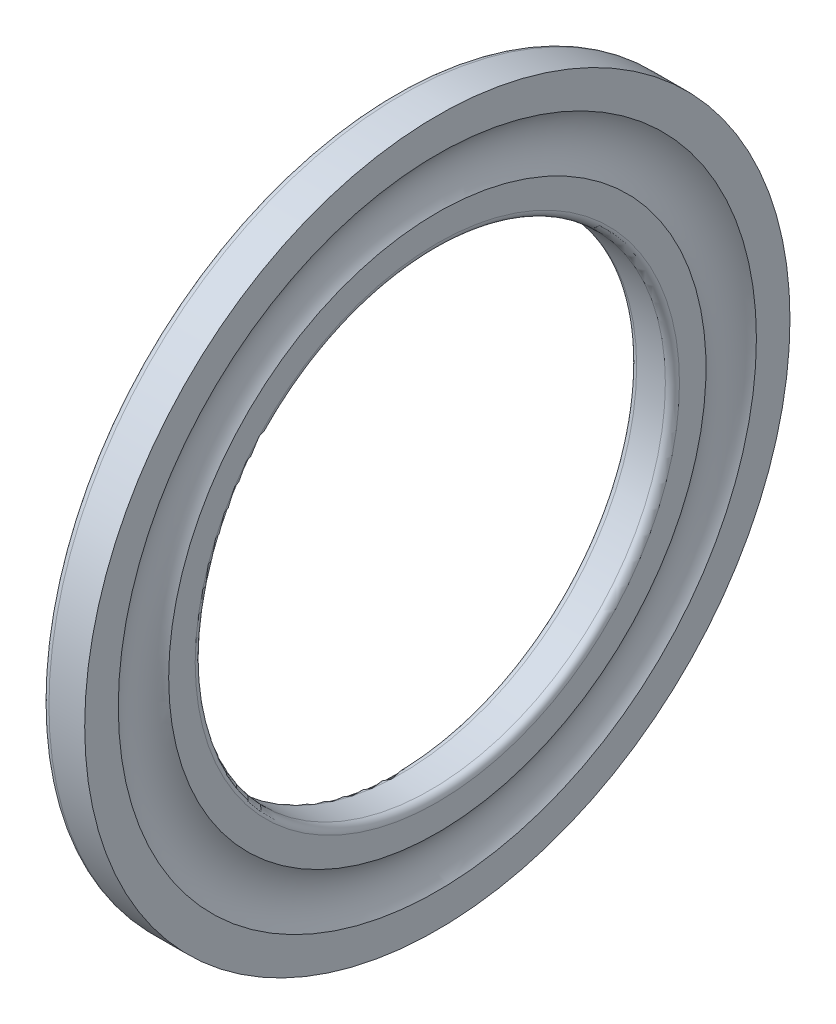
ISO-10303-21;
HEADER;
FILE_DESCRIPTION(('STEP AP214'),'2;1');
FILE_NAME('part.step','',(''),(''),'','','');
FILE_SCHEMA(('AUTOMOTIVE_DESIGN { 1 0 10303 214 1 1 1 1 }'));
ENDSEC;
DATA;
#1=APPLICATION_CONTEXT('core data for automotive mechanical design processes');
#2=APPLICATION_PROTOCOL_DEFINITION('international standard','automotive_design',2000,#1);
#3=PRODUCT_CONTEXT('',#1,'mechanical');
#4=PRODUCT('Part','Part','',(#3));
#5=PRODUCT_RELATED_PRODUCT_CATEGORY('part','',(#4));
#6=PRODUCT_DEFINITION_FORMATION('','',#4);
#7=PRODUCT_DEFINITION_CONTEXT('part definition',#1,'design');
#8=PRODUCT_DEFINITION('design','',#6,#7);
#9=PRODUCT_DEFINITION_SHAPE('','',#8);
#10=(LENGTH_UNIT() NAMED_UNIT(*) SI_UNIT(.MILLI.,.METRE.));
#11=(NAMED_UNIT(*) PLANE_ANGLE_UNIT() SI_UNIT($,.RADIAN.));
#12=(NAMED_UNIT(*) SI_UNIT($,.STERADIAN.) SOLID_ANGLE_UNIT());
#13=UNCERTAINTY_MEASURE_WITH_UNIT(LENGTH_MEASURE(1.E-05),#10,'distance_accuracy_value','');
#14=(GEOMETRIC_REPRESENTATION_CONTEXT(3) GLOBAL_UNCERTAINTY_ASSIGNED_CONTEXT((#13)) GLOBAL_UNIT_ASSIGNED_CONTEXT((#10,
#11,#12)) REPRESENTATION_CONTEXT('',''));
#15=CARTESIAN_POINT('',(0.,0.,0.));
#16=DIRECTION('',(0.,0.,1.));
#17=DIRECTION('',(1.,0.,0.));
#18=AXIS2_PLACEMENT_3D('',#15,#16,#17);
#19=CARTESIAN_POINT('',(0.,-29.946144488733,-29.4));
#20=DIRECTION('',(-1.,0.,0.));
#21=DIRECTION('',(0.,0.,1.));
#22=AXIS2_PLACEMENT_3D('',#19,#20,#21);
#23=PLANE('',#22);
#24=CARTESIAN_POINT('',(0.,0.,0.));
#25=DIRECTION('',(-1.,0.,0.));
#26=DIRECTION('',(0.,0.,-1.));
#27=AXIS2_PLACEMENT_3D('',#24,#25,#26);
#28=CIRCLE('',#27,29.4000000154857);
#29=CARTESIAN_POINT('',(0.,0.,-29.4000000154857));
#30=VERTEX_POINT('',#29);
#31=EDGE_CURVE('E47',#30,#30,#28,.F.);
#32=ORIENTED_EDGE('',*,*,#31,.F.);
#33=EDGE_LOOP('',(#32));
#34=FACE_BOUND('',#33,.T.);
#35=CARTESIAN_POINT('',(0.,0.,0.));
#36=DIRECTION('',(1.,0.,0.));
#37=DIRECTION('',(0.,0.,1.));
#38=AXIS2_PLACEMENT_3D('',#35,#36,#37);
#39=CIRCLE('',#38,20.6000000154857);
#40=CARTESIAN_POINT('',(0.,0.,20.6000000154857));
#41=VERTEX_POINT('',#40);
#42=EDGE_CURVE('E44',#41,#41,#39,.T.);
#43=ORIENTED_EDGE('',*,*,#42,.T.);
#44=EDGE_LOOP('',(#43));
#45=FACE_BOUND('',#44,.T.);
#46=ADVANCED_FACE('F15',(#34,#45),#23,.T.);
#47=CARTESIAN_POINT('',(3.6424,-23.2813957736601,22.8568));
#48=DIRECTION('',(1.,0.,0.));
#49=DIRECTION('',(0.,0.,-1.));
#50=AXIS2_PLACEMENT_3D('',#47,#48,#49);
#51=PLANE('',#50);
#52=CARTESIAN_POINT('',(3.6424,0.,0.));
#53=DIRECTION('',(1.,0.,0.));
#54=DIRECTION('',(0.,0.,1.));
#55=AXIS2_PLACEMENT_3D('',#52,#53,#54);
#56=CIRCLE('',#55,22.8568);
#57=CARTESIAN_POINT('',(3.6424,0.,22.8568));
#58=VERTEX_POINT('',#57);
#59=EDGE_CURVE('E41',#58,#58,#56,.T.);
#60=ORIENTED_EDGE('',*,*,#59,.T.);
#61=EDGE_LOOP('',(#60));
#62=FACE_BOUND('',#61,.T.);
#63=CARTESIAN_POINT('',(3.6424,0.,0.));
#64=DIRECTION('',(-1.,0.,0.));
#65=DIRECTION('',(0.,0.,-1.));
#66=AXIS2_PLACEMENT_3D('',#63,#64,#65);
#67=CIRCLE('',#66,20.6);
#68=CARTESIAN_POINT('',(3.6424,0.,-20.6));
#69=VERTEX_POINT('',#68);
#70=EDGE_CURVE('E38',#69,#69,#67,.F.);
#71=ORIENTED_EDGE('',*,*,#70,.F.);
#72=EDGE_LOOP('',(#71));
#73=FACE_BOUND('',#72,.T.);
#74=ADVANCED_FACE('F55',(#62,#73),#51,.T.);
#75=CARTESIAN_POINT('',(3.6424,-30.5572903122836,30.));
#76=DIRECTION('',(1.,0.,0.));
#77=DIRECTION('',(0.,0.,-1.));
#78=AXIS2_PLACEMENT_3D('',#75,#76,#77);
#79=PLANE('',#78);
#80=CARTESIAN_POINT('',(3.6424,0.,0.));
#81=DIRECTION('',(1.,0.,0.));
#82=DIRECTION('',(0.,0.,1.));
#83=AXIS2_PLACEMENT_3D('',#80,#81,#82);
#84=CIRCLE('',#83,30.);
#85=CARTESIAN_POINT('',(3.6424,0.,30.));
#86=VERTEX_POINT('',#85);
#87=EDGE_CURVE('E35',#86,#86,#84,.T.);
#88=ORIENTED_EDGE('',*,*,#87,.T.);
#89=EDGE_LOOP('',(#88));
#90=FACE_BOUND('',#89,.T.);
#91=CARTESIAN_POINT('',(3.6424,0.,0.));
#92=DIRECTION('',(-1.,0.,0.));
#93=DIRECTION('',(0.,0.,-1.));
#94=AXIS2_PLACEMENT_3D('',#91,#92,#93);
#95=CIRCLE('',#94,27.1432);
#96=CARTESIAN_POINT('',(3.6424,0.,-27.1432));
#97=VERTEX_POINT('',#96);
#98=EDGE_CURVE('E30',#97,#97,#95,.F.);
#99=ORIENTED_EDGE('',*,*,#98,.F.);
#100=EDGE_LOOP('',(#99));
#101=FACE_BOUND('',#100,.T.);
#102=ADVANCED_FACE('F62',(#90,#101),#79,.T.);
#103=CARTESIAN_POINT('',(0.599999999999874,0.,0.));
#104=DIRECTION('',(1.,0.,0.));
#105=DIRECTION('',(0.,0.,1.));
#106=AXIS2_PLACEMENT_3D('',#103,#104,#105);
#107=TOROIDAL_SURFACE('',#106,20.6,0.599999999999874);
#108=CARTESIAN_POINT('',(0.6,0.,0.));
#109=DIRECTION('',(1.,0.,0.));
#110=DIRECTION('',(0.,0.,1.));
#111=AXIS2_PLACEMENT_3D('',#108,#109,#110);
#112=CIRCLE('',#111,20.0000000000001);
#113=CARTESIAN_POINT('',(0.6,0.,20.0000000000001));
#114=VERTEX_POINT('',#113);
#115=EDGE_CURVE('E26',#114,#114,#112,.T.);
#116=ORIENTED_EDGE('',*,*,#115,.T.);
#117=EDGE_LOOP('',(#116));
#118=FACE_BOUND('',#117,.T.);
#119=ORIENTED_EDGE('',*,*,#42,.F.);
#120=EDGE_LOOP('',(#119));
#121=FACE_BOUND('',#120,.T.);
#122=ADVANCED_FACE('F59',(#118,#121),#107,.T.);
#123=CARTESIAN_POINT('',(3.6424,0.,0.));
#124=DIRECTION('',(1.,0.,0.));
#125=DIRECTION('',(0.,0.,1.));
#126=AXIS2_PLACEMENT_3D('',#123,#124,#125);
#127=CYLINDRICAL_SURFACE('',#126,20.);
#128=CARTESIAN_POINT('',(3.0424,0.,0.));
#129=DIRECTION('',(1.,0.,0.));
#130=DIRECTION('',(0.,0.,1.));
#131=AXIS2_PLACEMENT_3D('',#128,#129,#130);
#132=CIRCLE('',#131,20.);
#133=CARTESIAN_POINT('',(3.0424,0.,20.));
#134=VERTEX_POINT('',#133);
#135=EDGE_CURVE('E22',#134,#134,#132,.T.);
#136=ORIENTED_EDGE('',*,*,#135,.T.);
#137=EDGE_LOOP('',(#136));
#138=FACE_BOUND('',#137,.T.);
#139=ORIENTED_EDGE('',*,*,#115,.F.);
#140=EDGE_LOOP('',(#139));
#141=FACE_BOUND('',#140,.T.);
#142=ADVANCED_FACE('F61',(#138,#141),#127,.F.);
#143=CARTESIAN_POINT('',(3.04240000000007,0.,0.));
#144=DIRECTION('',(1.,0.,0.));
#145=DIRECTION('',(0.,0.,1.));
#146=AXIS2_PLACEMENT_3D('',#143,#144,#145);
#147=TOROIDAL_SURFACE('',#146,20.6,0.599999999999924);
#148=ORIENTED_EDGE('',*,*,#70,.T.);
#149=EDGE_LOOP('',(#148));
#150=FACE_BOUND('',#149,.T.);
#151=ORIENTED_EDGE('',*,*,#135,.F.);
#152=EDGE_LOOP('',(#151));
#153=FACE_BOUND('',#152,.T.);
#154=ADVANCED_FACE('F70',(#150,#153),#147,.T.);
#155=CARTESIAN_POINT('',(6.5,0.,0.));
#156=DIRECTION('',(1.,0.,0.));
#157=DIRECTION('',(0.,0.,1.));
#158=AXIS2_PLACEMENT_3D('',#155,#156,#157);
#159=TOROIDAL_SURFACE('',#158,25.,3.572);
#160=ORIENTED_EDGE('',*,*,#59,.F.);
#161=EDGE_LOOP('',(#160));
#162=FACE_BOUND('',#161,.T.);
#163=ORIENTED_EDGE('',*,*,#98,.T.);
#164=EDGE_LOOP('',(#163));
#165=FACE_BOUND('',#164,.T.);
#166=ADVANCED_FACE('F78',(#162,#165),#159,.F.);
#167=CARTESIAN_POINT('',(3.6424,0.,0.));
#168=DIRECTION('',(1.,0.,0.));
#169=DIRECTION('',(0.,0.,1.));
#170=AXIS2_PLACEMENT_3D('',#167,#168,#169);
#171=CYLINDRICAL_SURFACE('',#170,30.);
#172=CARTESIAN_POINT('',(0.599999999999936,0.,0.));
#173=DIRECTION('',(1.,0.,0.));
#174=DIRECTION('',(0.,0.,1.));
#175=AXIS2_PLACEMENT_3D('',#172,#173,#174);
#176=CIRCLE('',#175,30.);
#177=CARTESIAN_POINT('',(0.599999999999936,0.,30.));
#178=VERTEX_POINT('',#177);
#179=EDGE_CURVE('E10',#178,#178,#176,.T.);
#180=ORIENTED_EDGE('',*,*,#179,.T.);
#181=EDGE_LOOP('',(#180));
#182=FACE_BOUND('',#181,.T.);
#183=ORIENTED_EDGE('',*,*,#87,.F.);
#184=EDGE_LOOP('',(#183));
#185=FACE_BOUND('',#184,.T.);
#186=ADVANCED_FACE('F81',(#182,#185),#171,.T.);
#187=CARTESIAN_POINT('',(0.599999999999872,0.,0.));
#188=DIRECTION('',(1.,0.,0.));
#189=DIRECTION('',(0.,1.16855826160653E-09,1.));
#190=AXIS2_PLACEMENT_3D('',#187,#188,#189);
#191=TOROIDAL_SURFACE('',#190,29.4,0.599999999999872);
#192=ORIENTED_EDGE('',*,*,#31,.T.);
#193=EDGE_LOOP('',(#192));
#194=FACE_BOUND('',#193,.T.);
#195=ORIENTED_EDGE('',*,*,#179,.F.);
#196=EDGE_LOOP('',(#195));
#197=FACE_BOUND('',#196,.T.);
#198=ADVANCED_FACE('F17',(#194,#197),#191,.T.);
#199=CLOSED_SHELL('',(#46,#74,#102,#122,#142,#154,#166,#186,#198));
#200=MANIFOLD_SOLID_BREP('B1',#199);
#201=ADVANCED_BREP_SHAPE_REPRESENTATION('',(#18,#200),#14);
#202=SHAPE_DEFINITION_REPRESENTATION(#9,#201);
ENDSEC;
END-ISO-10303-21;
